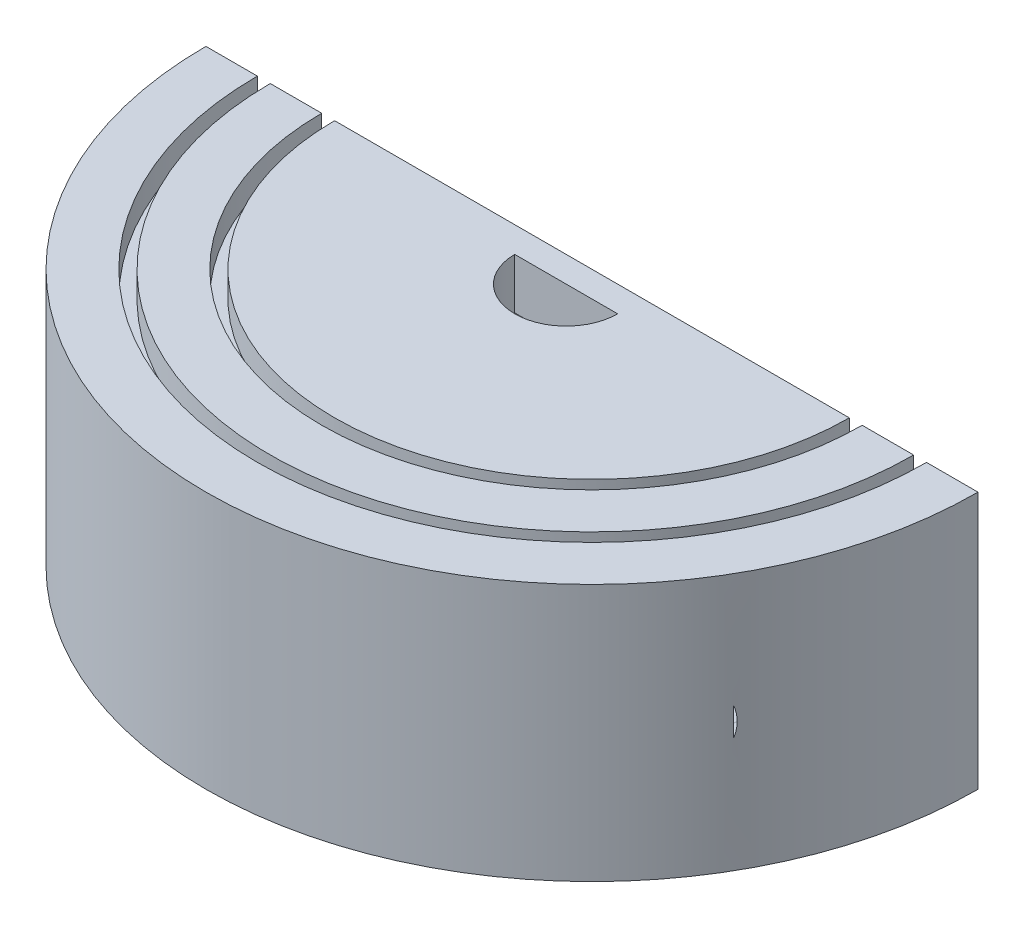
ISO-10303-21;
HEADER;
FILE_DESCRIPTION(('STEP AP214'),'2;1');
FILE_NAME('part.step','',(''),(''),'','','');
FILE_SCHEMA(('AUTOMOTIVE_DESIGN { 1 0 10303 214 1 1 1 1 }'));
ENDSEC;
DATA;
#1=APPLICATION_CONTEXT('core data for automotive mechanical design processes');
#2=APPLICATION_PROTOCOL_DEFINITION('international standard','automotive_design',2000,#1);
#3=PRODUCT_CONTEXT('',#1,'mechanical');
#4=PRODUCT('Part','Part','',(#3));
#5=PRODUCT_RELATED_PRODUCT_CATEGORY('part','',(#4));
#6=PRODUCT_DEFINITION_FORMATION('','',#4);
#7=PRODUCT_DEFINITION_CONTEXT('part definition',#1,'design');
#8=PRODUCT_DEFINITION('design','',#6,#7);
#9=PRODUCT_DEFINITION_SHAPE('','',#8);
#10=(LENGTH_UNIT() NAMED_UNIT(*) SI_UNIT(.MILLI.,.METRE.));
#11=(NAMED_UNIT(*) PLANE_ANGLE_UNIT() SI_UNIT($,.RADIAN.));
#12=(NAMED_UNIT(*) SI_UNIT($,.STERADIAN.) SOLID_ANGLE_UNIT());
#13=UNCERTAINTY_MEASURE_WITH_UNIT(LENGTH_MEASURE(1.E-05),#10,'distance_accuracy_value','');
#14=(GEOMETRIC_REPRESENTATION_CONTEXT(3) GLOBAL_UNCERTAINTY_ASSIGNED_CONTEXT((#13)) GLOBAL_UNIT_ASSIGNED_CONTEXT((#10,
#11,#12)) REPRESENTATION_CONTEXT('',''));
#15=CARTESIAN_POINT('',(0.,0.,0.));
#16=DIRECTION('',(0.,0.,1.));
#17=DIRECTION('',(1.,0.,0.));
#18=AXIS2_PLACEMENT_3D('',#15,#16,#17);
#19=CARTESIAN_POINT('',(15.,5.,0.));
#20=DIRECTION('',(0.,1.,0.));
#21=DIRECTION('',(0.,0.,1.));
#22=AXIS2_PLACEMENT_3D('',#19,#20,#21);
#23=PLANE('',#22);
#24=DIRECTION('',(-1.,0.,0.));
#25=VECTOR('',#24,1.);
#26=CARTESIAN_POINT('',(0.,5.,0.));
#27=LINE('',#26,#25);
#28=CARTESIAN_POINT('',(25.,5.,0.));
#29=VERTEX_POINT('',#28);
#30=CARTESIAN_POINT('',(5.,5.,0.));
#31=VERTEX_POINT('',#30);
#32=EDGE_CURVE('E578',#29,#31,#27,.T.);
#33=ORIENTED_EDGE('',*,*,#32,.T.);
#34=CARTESIAN_POINT('',(15.,5.,0.));
#35=DIRECTION('',(0.,1.,0.));
#36=DIRECTION('',(0.,0.,1.));
#37=AXIS2_PLACEMENT_3D('',#34,#35,#36);
#38=CIRCLE('',#37,10.);
#39=EDGE_CURVE('E310',#31,#29,#38,.T.);
#40=ORIENTED_EDGE('',*,*,#39,.T.);
#41=EDGE_LOOP('',(#33,#40));
#42=FACE_BOUND('',#41,.T.);
#43=DIRECTION('',(1.,0.,0.));
#44=VECTOR('',#43,1.);
#45=CARTESIAN_POINT('',(13.,5.,0.999999999999999));
#46=LINE('',#45,#44);
#47=CARTESIAN_POINT('',(13.,5.,0.999999999999999));
#48=VERTEX_POINT('',#47);
#49=CARTESIAN_POINT('',(17.,5.,0.999999999999999));
#50=VERTEX_POINT('',#49);
#51=EDGE_CURVE('E229',#48,#50,#46,.T.);
#52=ORIENTED_EDGE('',*,*,#51,.T.);
#53=CARTESIAN_POINT('',(15.,5.,0.999999999999996));
#54=DIRECTION('',(0.,-1.,0.));
#55=DIRECTION('',(0.,0.,1.));
#56=AXIS2_PLACEMENT_3D('',#53,#54,#55);
#57=CIRCLE('',#56,2.);
#58=EDGE_CURVE('E60',#50,#48,#57,.T.);
#59=ORIENTED_EDGE('',*,*,#58,.T.);
#60=EDGE_LOOP('',(#52,#59));
#61=FACE_BOUND('',#60,.T.);
#62=ADVANCED_FACE('F43',(#42,#61),#23,.T.);
#63=CARTESIAN_POINT('',(5.03017551316105,3.03195270623563,7.5));
#64=DIRECTION('',(0.,1.,0.));
#65=DIRECTION('',(-1.,0.,0.));
#66=AXIS2_PLACEMENT_3D('',#63,#64,#65);
#67=PLANE('',#66);
#68=DIRECTION('',(1.,0.,0.));
#69=VECTOR('',#68,1.);
#70=CARTESIAN_POINT('',(5.03017551316105,3.03195270623563,0.));
#71=LINE('',#70,#69);
#72=CARTESIAN_POINT('',(5.03017551316105,3.03195270623563,0.));
#73=VERTEX_POINT('',#72);
#74=CARTESIAN_POINT('',(25.0301755131611,3.03195270623562,0.));
#75=VERTEX_POINT('',#74);
#76=EDGE_CURVE('E288',#73,#75,#71,.T.);
#77=ORIENTED_EDGE('',*,*,#76,.T.);
#78=DIRECTION('',(0.,0.,-1.));
#79=VECTOR('',#78,1.);
#80=CARTESIAN_POINT('',(25.0301755131611,3.03195270623562,7.5));
#81=LINE('',#80,#79);
#82=CARTESIAN_POINT('',(25.0301755131611,3.03195270623562,7.5));
#83=VERTEX_POINT('',#82);
#84=EDGE_CURVE('E292',#83,#75,#81,.T.);
#85=ORIENTED_EDGE('',*,*,#84,.F.);
#86=DIRECTION('',(1.,0.,0.));
#87=VECTOR('',#86,1.);
#88=CARTESIAN_POINT('',(5.03017551316105,3.03195270623563,7.5));
#89=LINE('',#88,#87);
#90=CARTESIAN_POINT('',(5.03017551316105,3.03195270623563,7.5));
#91=VERTEX_POINT('',#90);
#92=EDGE_CURVE('E273',#91,#83,#89,.T.);
#93=ORIENTED_EDGE('',*,*,#92,.F.);
#94=DIRECTION('',(0.,0.,-1.));
#95=VECTOR('',#94,1.);
#96=CARTESIAN_POINT('',(5.03017551316105,3.03195270623563,7.5));
#97=LINE('',#96,#95);
#98=EDGE_CURVE('E296',#91,#73,#97,.T.);
#99=ORIENTED_EDGE('',*,*,#98,.T.);
#100=EDGE_LOOP('',(#77,#85,#93,#99));
#101=FACE_BOUND('',#100,.T.);
#102=CARTESIAN_POINT('',(15.,3.03195270623562,0.999999999999996));
#103=DIRECTION('',(0.,1.,0.));
#104=DIRECTION('',(-1.,0.,0.));
#105=AXIS2_PLACEMENT_3D('',#102,#103,#104);
#106=CIRCLE('',#105,2.);
#107=CARTESIAN_POINT('',(17.,3.03195270623562,0.999999999999999));
#108=VERTEX_POINT('',#107);
#109=CARTESIAN_POINT('',(13.,3.03195270623562,0.999999999999998));
#110=VERTEX_POINT('',#109);
#111=EDGE_CURVE('E11',#108,#110,#106,.F.);
#112=ORIENTED_EDGE('',*,*,#111,.F.);
#113=DIRECTION('',(1.,0.,0.));
#114=VECTOR('',#113,1.);
#115=CARTESIAN_POINT('',(5.03017551316105,3.03195270623563,0.999999999999998));
#116=LINE('',#115,#114);
#117=EDGE_CURVE('E53',#110,#108,#116,.T.);
#118=ORIENTED_EDGE('',*,*,#117,.F.);
#119=EDGE_LOOP('',(#112,#118));
#120=FACE_BOUND('',#119,.T.);
#121=ADVANCED_FACE('F561',(#101,#120),#67,.F.);
#122=CARTESIAN_POINT('',(0.,5.,0.));
#123=DIRECTION('',(0.,0.,1.));
#124=DIRECTION('',(1.,0.,0.));
#125=AXIS2_PLACEMENT_3D('',#122,#123,#124);
#126=PLANE('',#125);
#127=DIRECTION('',(-1.,0.,0.));
#128=VECTOR('',#127,1.);
#129=CARTESIAN_POINT('',(25.0301755131611,-3.,0.));
#130=LINE('',#129,#128);
#131=CARTESIAN_POINT('',(25.0301755131611,-3.,0.));
#132=VERTEX_POINT('',#131);
#133=CARTESIAN_POINT('',(5.03017551316105,-3.,0.));
#134=VERTEX_POINT('',#133);
#135=EDGE_CURVE('E280',#132,#134,#130,.T.);
#136=ORIENTED_EDGE('',*,*,#135,.F.);
#137=CARTESIAN_POINT('',(25.0301755131611,0.0159763531178115,0.));
#138=DIRECTION('',(0.,0.,-1.));
#139=DIRECTION('',(-1.,0.,0.));
#140=AXIS2_PLACEMENT_3D('',#137,#138,#139);
#141=CIRCLE('',#140,3.01597635311781);
#142=EDGE_CURVE('E257',#75,#132,#141,.T.);
#143=ORIENTED_EDGE('',*,*,#142,.F.);
#144=ORIENTED_EDGE('',*,*,#76,.F.);
#145=CARTESIAN_POINT('',(5.03017551316105,0.0159763531178128,0.));
#146=DIRECTION('',(0.,0.,-1.));
#147=DIRECTION('',(1.,0.,0.));
#148=AXIS2_PLACEMENT_3D('',#145,#146,#147);
#149=CIRCLE('',#148,3.01597635311781);
#150=EDGE_CURVE('E284',#134,#73,#149,.T.);
#151=ORIENTED_EDGE('',*,*,#150,.F.);
#152=EDGE_LOOP('',(#136,#143,#144,#151));
#153=FACE_BOUND('',#152,.T.);
#154=DIRECTION('',(0.,1.,0.));
#155=VECTOR('',#154,1.);
#156=CARTESIAN_POINT('',(4.5,4.,0.));
#157=LINE('',#156,#155);
#158=CARTESIAN_POINT('',(4.5,4.,0.));
#159=VERTEX_POINT('',#158);
#160=CARTESIAN_POINT('',(4.5,5.,0.));
#161=VERTEX_POINT('',#160);
#162=EDGE_CURVE('E328',#159,#161,#157,.T.);
#163=ORIENTED_EDGE('',*,*,#162,.F.);
#164=DIRECTION('',(1.,0.,0.));
#165=VECTOR('',#164,1.);
#166=CARTESIAN_POINT('',(4.5,4.,0.));
#167=LINE('',#166,#165);
#168=CARTESIAN_POINT('',(5.,4.,0.));
#169=VERTEX_POINT('',#168);
#170=EDGE_CURVE('E317',#159,#169,#167,.T.);
#171=ORIENTED_EDGE('',*,*,#170,.T.);
#172=DIRECTION('',(0.,1.,0.));
#173=VECTOR('',#172,1.);
#174=CARTESIAN_POINT('',(5.,4.,0.));
#175=LINE('',#174,#173);
#176=EDGE_CURVE('E332',#169,#31,#175,.T.);
#177=ORIENTED_EDGE('',*,*,#176,.T.);
#178=ORIENTED_EDGE('',*,*,#32,.F.);
#179=DIRECTION('',(0.,1.,0.));
#180=VECTOR('',#179,1.);
#181=CARTESIAN_POINT('',(25.,4.,0.));
#182=LINE('',#181,#180);
#183=CARTESIAN_POINT('',(25.,4.,0.));
#184=VERTEX_POINT('',#183);
#185=EDGE_CURVE('E336',#184,#29,#182,.T.);
#186=ORIENTED_EDGE('',*,*,#185,.F.);
#187=DIRECTION('',(1.,0.,0.));
#188=VECTOR('',#187,1.);
#189=CARTESIAN_POINT('',(25.,4.,0.));
#190=LINE('',#189,#188);
#191=CARTESIAN_POINT('',(25.5,4.,0.));
#192=VERTEX_POINT('',#191);
#193=EDGE_CURVE('E309',#184,#192,#190,.T.);
#194=ORIENTED_EDGE('',*,*,#193,.T.);
#195=DIRECTION('',(0.,1.,0.));
#196=VECTOR('',#195,1.);
#197=CARTESIAN_POINT('',(25.5,4.,0.));
#198=LINE('',#197,#196);
#199=CARTESIAN_POINT('',(25.5,5.,0.));
#200=VERTEX_POINT('',#199);
#201=EDGE_CURVE('E321',#192,#200,#198,.T.);
#202=ORIENTED_EDGE('',*,*,#201,.T.);
#203=CARTESIAN_POINT('',(27.5,5.,0.));
#204=VERTEX_POINT('',#203);
#205=EDGE_CURVE('E463',#204,#200,#27,.T.);
#206=ORIENTED_EDGE('',*,*,#205,.F.);
#207=DIRECTION('',(0.,1.,0.));
#208=VECTOR('',#207,1.);
#209=CARTESIAN_POINT('',(27.5,4.,0.));
#210=LINE('',#209,#208);
#211=CARTESIAN_POINT('',(27.5,4.,0.));
#212=VERTEX_POINT('',#211);
#213=EDGE_CURVE('E373',#212,#204,#210,.T.);
#214=ORIENTED_EDGE('',*,*,#213,.F.);
#215=DIRECTION('',(1.,0.,0.));
#216=VECTOR('',#215,1.);
#217=CARTESIAN_POINT('',(27.5,4.,0.));
#218=LINE('',#217,#216);
#219=CARTESIAN_POINT('',(28.,4.,0.));
#220=VERTEX_POINT('',#219);
#221=EDGE_CURVE('E346',#212,#220,#218,.T.);
#222=ORIENTED_EDGE('',*,*,#221,.T.);
#223=DIRECTION('',(0.,1.,0.));
#224=VECTOR('',#223,1.);
#225=CARTESIAN_POINT('',(28.,4.,0.));
#226=LINE('',#225,#224);
#227=CARTESIAN_POINT('',(28.,5.,0.));
#228=VERTEX_POINT('',#227);
#229=EDGE_CURVE('E358',#220,#228,#226,.T.);
#230=ORIENTED_EDGE('',*,*,#229,.T.);
#231=CARTESIAN_POINT('',(30.,5.,0.));
#232=VERTEX_POINT('',#231);
#233=EDGE_CURVE('E458',#232,#228,#27,.T.);
#234=ORIENTED_EDGE('',*,*,#233,.F.);
#235=DIRECTION('',(0.,-1.,0.));
#236=VECTOR('',#235,1.);
#237=CARTESIAN_POINT('',(30.,5.,0.));
#238=LINE('',#237,#236);
#239=CARTESIAN_POINT('',(30.,-5.,0.));
#240=VERTEX_POINT('',#239);
#241=EDGE_CURVE('E477',#232,#240,#238,.T.);
#242=ORIENTED_EDGE('',*,*,#241,.T.);
#243=DIRECTION('',(-1.,0.,0.));
#244=VECTOR('',#243,1.);
#245=CARTESIAN_POINT('',(0.,-5.,0.));
#246=LINE('',#245,#244);
#247=CARTESIAN_POINT('',(28.,-5.,0.));
#248=VERTEX_POINT('',#247);
#249=EDGE_CURVE('E457',#240,#248,#246,.T.);
#250=ORIENTED_EDGE('',*,*,#249,.T.);
#251=DIRECTION('',(0.,-1.,0.));
#252=VECTOR('',#251,1.);
#253=CARTESIAN_POINT('',(28.,-4.,0.));
#254=LINE('',#253,#252);
#255=CARTESIAN_POINT('',(28.,-4.,0.));
#256=VERTEX_POINT('',#255);
#257=EDGE_CURVE('E437',#256,#248,#254,.T.);
#258=ORIENTED_EDGE('',*,*,#257,.F.);
#259=DIRECTION('',(1.,0.,0.));
#260=VECTOR('',#259,1.);
#261=CARTESIAN_POINT('',(27.5,-4.,0.));
#262=LINE('',#261,#260);
#263=CARTESIAN_POINT('',(27.5,-4.,0.));
#264=VERTEX_POINT('',#263);
#265=EDGE_CURVE('E428',#264,#256,#262,.T.);
#266=ORIENTED_EDGE('',*,*,#265,.F.);
#267=DIRECTION('',(0.,-1.,0.));
#268=VECTOR('',#267,1.);
#269=CARTESIAN_POINT('',(27.5,-4.,0.));
#270=LINE('',#269,#268);
#271=CARTESIAN_POINT('',(27.5,-5.,0.));
#272=VERTEX_POINT('',#271);
#273=EDGE_CURVE('E441',#264,#272,#270,.T.);
#274=ORIENTED_EDGE('',*,*,#273,.T.);
#275=CARTESIAN_POINT('',(25.5,-5.,0.));
#276=VERTEX_POINT('',#275);
#277=EDGE_CURVE('E472',#272,#276,#246,.T.);
#278=ORIENTED_EDGE('',*,*,#277,.T.);
#279=DIRECTION('',(0.,-1.,0.));
#280=VECTOR('',#279,1.);
#281=CARTESIAN_POINT('',(25.5,-4.,0.));
#282=LINE('',#281,#280);
#283=CARTESIAN_POINT('',(25.5,-4.,0.));
#284=VERTEX_POINT('',#283);
#285=EDGE_CURVE('E401',#284,#276,#282,.T.);
#286=ORIENTED_EDGE('',*,*,#285,.F.);
#287=DIRECTION('',(1.,0.,0.));
#288=VECTOR('',#287,1.);
#289=CARTESIAN_POINT('',(25.,-4.,0.));
#290=LINE('',#289,#288);
#291=CARTESIAN_POINT('',(25.,-4.,0.));
#292=VERTEX_POINT('',#291);
#293=EDGE_CURVE('E392',#292,#284,#290,.T.);
#294=ORIENTED_EDGE('',*,*,#293,.F.);
#295=DIRECTION('',(0.,-1.,0.));
#296=VECTOR('',#295,1.);
#297=CARTESIAN_POINT('',(25.,-4.,0.));
#298=LINE('',#297,#296);
#299=CARTESIAN_POINT('',(25.,-5.,0.));
#300=VERTEX_POINT('',#299);
#301=EDGE_CURVE('E405',#292,#300,#298,.T.);
#302=ORIENTED_EDGE('',*,*,#301,.T.);
#303=CARTESIAN_POINT('',(5.,-5.,0.));
#304=VERTEX_POINT('',#303);
#305=EDGE_CURVE('E618',#300,#304,#246,.T.);
#306=ORIENTED_EDGE('',*,*,#305,.T.);
#307=DIRECTION('',(0.,-1.,0.));
#308=VECTOR('',#307,1.);
#309=CARTESIAN_POINT('',(5.,-4.,0.));
#310=LINE('',#309,#308);
#311=CARTESIAN_POINT('',(5.,-4.,0.));
#312=VERTEX_POINT('',#311);
#313=EDGE_CURVE('E409',#312,#304,#310,.T.);
#314=ORIENTED_EDGE('',*,*,#313,.F.);
#315=DIRECTION('',(1.,0.,0.));
#316=VECTOR('',#315,1.);
#317=CARTESIAN_POINT('',(4.5,-4.,0.));
#318=LINE('',#317,#316);
#319=CARTESIAN_POINT('',(4.5,-4.,0.));
#320=VERTEX_POINT('',#319);
#321=EDGE_CURVE('E383',#320,#312,#318,.T.);
#322=ORIENTED_EDGE('',*,*,#321,.F.);
#323=DIRECTION('',(0.,-1.,0.));
#324=VECTOR('',#323,1.);
#325=CARTESIAN_POINT('',(4.5,-4.,0.));
#326=LINE('',#325,#324);
#327=CARTESIAN_POINT('',(4.5,-5.,0.));
#328=VERTEX_POINT('',#327);
#329=EDGE_CURVE('E396',#320,#328,#326,.T.);
#330=ORIENTED_EDGE('',*,*,#329,.T.);
#331=CARTESIAN_POINT('',(2.5,-5.,0.));
#332=VERTEX_POINT('',#331);
#333=EDGE_CURVE('E473',#328,#332,#246,.T.);
#334=ORIENTED_EDGE('',*,*,#333,.T.);
#335=DIRECTION('',(0.,-1.,0.));
#336=VECTOR('',#335,1.);
#337=CARTESIAN_POINT('',(2.5,-4.,0.));
#338=LINE('',#337,#336);
#339=CARTESIAN_POINT('',(2.5,-4.,0.));
#340=VERTEX_POINT('',#339);
#341=EDGE_CURVE('E445',#340,#332,#338,.T.);
#342=ORIENTED_EDGE('',*,*,#341,.F.);
#343=DIRECTION('',(1.,0.,0.));
#344=VECTOR('',#343,1.);
#345=CARTESIAN_POINT('',(2.,-4.,0.));
#346=LINE('',#345,#344);
#347=CARTESIAN_POINT('',(2.,-4.,0.));
#348=VERTEX_POINT('',#347);
#349=EDGE_CURVE('E419',#348,#340,#346,.T.);
#350=ORIENTED_EDGE('',*,*,#349,.F.);
#351=DIRECTION('',(0.,-1.,0.));
#352=VECTOR('',#351,1.);
#353=CARTESIAN_POINT('',(2.,-4.,0.));
#354=LINE('',#353,#352);
#355=CARTESIAN_POINT('',(2.,-5.,0.));
#356=VERTEX_POINT('',#355);
#357=EDGE_CURVE('E432',#348,#356,#354,.T.);
#358=ORIENTED_EDGE('',*,*,#357,.T.);
#359=CARTESIAN_POINT('',(0.,-5.,0.));
#360=VERTEX_POINT('',#359);
#361=EDGE_CURVE('E468',#356,#360,#246,.T.);
#362=ORIENTED_EDGE('',*,*,#361,.T.);
#363=DIRECTION('',(0.,-1.,0.));
#364=VECTOR('',#363,1.);
#365=CARTESIAN_POINT('',(0.,5.,0.));
#366=LINE('',#365,#364);
#367=CARTESIAN_POINT('',(0.,5.,0.));
#368=VERTEX_POINT('',#367);
#369=EDGE_CURVE('E462',#368,#360,#366,.T.);
#370=ORIENTED_EDGE('',*,*,#369,.F.);
#371=CARTESIAN_POINT('',(2.,5.,0.));
#372=VERTEX_POINT('',#371);
#373=EDGE_CURVE('E456',#372,#368,#27,.T.);
#374=ORIENTED_EDGE('',*,*,#373,.F.);
#375=DIRECTION('',(0.,1.,0.));
#376=VECTOR('',#375,1.);
#377=CARTESIAN_POINT('',(2.,4.,0.));
#378=LINE('',#377,#376);
#379=CARTESIAN_POINT('',(2.,4.,0.));
#380=VERTEX_POINT('',#379);
#381=EDGE_CURVE('E365',#380,#372,#378,.T.);
#382=ORIENTED_EDGE('',*,*,#381,.F.);
#383=DIRECTION('',(1.,0.,0.));
#384=VECTOR('',#383,1.);
#385=CARTESIAN_POINT('',(2.,4.,0.));
#386=LINE('',#385,#384);
#387=CARTESIAN_POINT('',(2.5,4.,0.));
#388=VERTEX_POINT('',#387);
#389=EDGE_CURVE('E354',#380,#388,#386,.T.);
#390=ORIENTED_EDGE('',*,*,#389,.T.);
#391=DIRECTION('',(0.,1.,0.));
#392=VECTOR('',#391,1.);
#393=CARTESIAN_POINT('',(2.5,4.,0.));
#394=LINE('',#393,#392);
#395=CARTESIAN_POINT('',(2.5,5.,0.));
#396=VERTEX_POINT('',#395);
#397=EDGE_CURVE('E369',#388,#396,#394,.T.);
#398=ORIENTED_EDGE('',*,*,#397,.T.);
#399=EDGE_CURVE('E464',#161,#396,#27,.T.);
#400=ORIENTED_EDGE('',*,*,#399,.F.);
#401=EDGE_LOOP('',(#163,#171,#177,#178,#186,#194,#202,#206,#214,#222,#230,#234,#242,#250,#258,
#266,#274,#278,#286,#294,#302,#306,#314,#322,#330,#334,#342,#350,#358,#362,#370,#374,#382,#390,
#398,#400));
#402=FACE_BOUND('',#401,.T.);
#403=ADVANCED_FACE('F559',(#153,#402),#126,.F.);
#404=ORIENTED_EDGE('',*,*,#205,.T.);
#405=CARTESIAN_POINT('',(15.,5.,0.));
#406=DIRECTION('',(0.,-1.,0.));
#407=DIRECTION('',(0.,0.,1.));
#408=AXIS2_PLACEMENT_3D('',#405,#406,#407);
#409=CIRCLE('',#408,10.5);
#410=EDGE_CURVE('E295',#200,#161,#409,.T.);
#411=ORIENTED_EDGE('',*,*,#410,.T.);
#412=ORIENTED_EDGE('',*,*,#399,.T.);
#413=CARTESIAN_POINT('',(15.,5.,0.));
#414=DIRECTION('',(0.,1.,0.));
#415=DIRECTION('',(0.,0.,1.));
#416=AXIS2_PLACEMENT_3D('',#413,#414,#415);
#417=CIRCLE('',#416,12.5);
#418=EDGE_CURVE('E347',#396,#204,#417,.T.);
#419=ORIENTED_EDGE('',*,*,#418,.T.);
#420=EDGE_LOOP('',(#404,#411,#412,#419));
#421=FACE_BOUND('',#420,.T.);
#422=ADVANCED_FACE('F554',(#421),#23,.T.);
#423=ORIENTED_EDGE('',*,*,#233,.T.);
#424=CARTESIAN_POINT('',(15.,5.,0.));
#425=DIRECTION('',(0.,-1.,0.));
#426=DIRECTION('',(0.,0.,1.));
#427=AXIS2_PLACEMENT_3D('',#424,#425,#426);
#428=CIRCLE('',#427,13.);
#429=EDGE_CURVE('E331',#228,#372,#428,.T.);
#430=ORIENTED_EDGE('',*,*,#429,.T.);
#431=ORIENTED_EDGE('',*,*,#373,.T.);
#432=CARTESIAN_POINT('',(15.,5.,0.));
#433=DIRECTION('',(0.,1.,0.));
#434=DIRECTION('',(0.,0.,1.));
#435=AXIS2_PLACEMENT_3D('',#432,#433,#434);
#436=CIRCLE('',#435,15.);
#437=EDGE_CURVE('E452',#368,#232,#436,.T.);
#438=ORIENTED_EDGE('',*,*,#437,.T.);
#439=EDGE_LOOP('',(#423,#430,#431,#438));
#440=FACE_BOUND('',#439,.T.);
#441=ADVANCED_FACE('F550',(#440),#23,.T.);
#442=CARTESIAN_POINT('',(15.,-5.,0.));
#443=DIRECTION('',(0.,1.,0.));
#444=DIRECTION('',(0.,0.,1.));
#445=AXIS2_PLACEMENT_3D('',#442,#443,#444);
#446=PLANE('',#445);
#447=ORIENTED_EDGE('',*,*,#333,.F.);
#448=CARTESIAN_POINT('',(15.,-5.,0.));
#449=DIRECTION('',(0.,-1.,0.));
#450=DIRECTION('',(0.,0.,1.));
#451=AXIS2_PLACEMENT_3D('',#448,#449,#450);
#452=CIRCLE('',#451,10.5);
#453=EDGE_CURVE('E368',#276,#328,#452,.T.);
#454=ORIENTED_EDGE('',*,*,#453,.F.);
#455=ORIENTED_EDGE('',*,*,#277,.F.);
#456=CARTESIAN_POINT('',(15.,-5.,0.));
#457=DIRECTION('',(0.,1.,0.));
#458=DIRECTION('',(0.,0.,1.));
#459=AXIS2_PLACEMENT_3D('',#456,#457,#458);
#460=CIRCLE('',#459,12.5);
#461=EDGE_CURVE('E420',#332,#272,#460,.T.);
#462=ORIENTED_EDGE('',*,*,#461,.F.);
#463=EDGE_LOOP('',(#447,#454,#455,#462));
#464=FACE_BOUND('',#463,.T.);
#465=ADVANCED_FACE('F553',(#464),#446,.F.);
#466=ORIENTED_EDGE('',*,*,#361,.F.);
#467=CARTESIAN_POINT('',(15.,-5.,0.));
#468=DIRECTION('',(0.,-1.,0.));
#469=DIRECTION('',(0.,0.,1.));
#470=AXIS2_PLACEMENT_3D('',#467,#468,#469);
#471=CIRCLE('',#470,13.);
#472=EDGE_CURVE('E404',#248,#356,#471,.T.);
#473=ORIENTED_EDGE('',*,*,#472,.F.);
#474=ORIENTED_EDGE('',*,*,#249,.F.);
#475=CARTESIAN_POINT('',(15.,-5.,0.));
#476=DIRECTION('',(0.,1.,0.));
#477=DIRECTION('',(0.,0.,1.));
#478=AXIS2_PLACEMENT_3D('',#475,#476,#477);
#479=CIRCLE('',#478,15.);
#480=EDGE_CURVE('E440',#360,#240,#479,.T.);
#481=ORIENTED_EDGE('',*,*,#480,.F.);
#482=EDGE_LOOP('',(#466,#473,#474,#481));
#483=FACE_BOUND('',#482,.T.);
#484=ADVANCED_FACE('F558',(#483),#446,.F.);
#485=CARTESIAN_POINT('',(15.,5.,0.));
#486=DIRECTION('',(0.,-1.,0.));
#487=DIRECTION('',(0.,0.,-1.));
#488=AXIS2_PLACEMENT_3D('',#485,#486,#487);
#489=CYLINDRICAL_SURFACE('',#488,15.);
#490=DIRECTION('',(0.,-1.,0.));
#491=VECTOR('',#490,1.);
#492=CARTESIAN_POINT('',(27.9903810567666,5.,7.5));
#493=LINE('',#492,#491);
#494=CARTESIAN_POINT('',(27.9903810567666,0.593294724705732,7.5));
#495=VERTEX_POINT('',#494);
#496=CARTESIAN_POINT('',(27.9903810567666,-0.561342018470109,7.5));
#497=VERTEX_POINT('',#496);
#498=EDGE_CURVE('E481',#495,#497,#493,.T.);
#499=ORIENTED_EDGE('',*,*,#498,.F.);
#500=CARTESIAN_POINT('',(27.9903810567666,0.593294724705732,7.5));
#501=CARTESIAN_POINT('',(27.9984900648463,0.551717165458329,7.48595424944893));
#502=CARTESIAN_POINT('',(28.0058041978693,0.50954217929078,7.47323395373268));
#503=CARTESIAN_POINT('',(28.0187199121707,0.424127161387559,7.45071139909798));
#504=CARTESIAN_POINT('',(28.0243200191941,0.380886247177474,7.44091165236944));
#505=CARTESIAN_POINT('',(28.0383188183036,0.250120361643426,7.41637498908912));
#506=CARTESIAN_POINT('',(28.0439642568141,0.161310318781378,7.40641641348626));
#507=CARTESIAN_POINT('',(28.0472984422139,-0.0172946598070621,7.40054177530781));
#508=CARTESIAN_POINT('',(28.0449506683543,-0.107092242584141,7.40469016694302));
#509=CARTESIAN_POINT('',(28.0324782762873,-0.284306904786718,7.42661792395137));
#510=CARTESIAN_POINT('',(28.0223664348963,-0.371727651132993,7.44437489448926));
#511=CARTESIAN_POINT('',(28.0060625687695,-0.474464231465477,7.47277499504538));
#512=CARTESIAN_POINT('',(28.0031197783482,-0.49199125018281,7.47789498397903));
#513=CARTESIAN_POINT('',(27.9969567146168,-0.526824733467985,7.4886016797013));
#514=CARTESIAN_POINT('',(27.9937368452057,-0.544131478231265,7.49418770679379));
#515=CARTESIAN_POINT('',(27.9903810567666,-0.561342018470109,7.50000000000001));
#516=B_SPLINE_CURVE_WITH_KNOTS('',3,(#500,#501,#502,#503,#504,#505,#506,#507,#508,#509,#510,
#511,#512,#513,#514,#515),.UNSPECIFIED.,.F.,.F.,(4,2,2,2,2,2,2,4),(0.,0.133835281276028,
0.26778535453262,0.534912971763941,0.803262721932365,1.07117181050821,1.12665491525787,
1.18205846942805),.UNSPECIFIED.);
#517=EDGE_CURVE('E484',#495,#497,#516,.T.);
#518=ORIENTED_EDGE('',*,*,#517,.T.);
#519=EDGE_LOOP('',(#499,#518));
#520=FACE_BOUND('',#519,.T.);
#521=ORIENTED_EDGE('',*,*,#480,.T.);
#522=ORIENTED_EDGE('',*,*,#241,.F.);
#523=ORIENTED_EDGE('',*,*,#437,.F.);
#524=ORIENTED_EDGE('',*,*,#369,.T.);
#525=EDGE_LOOP('',(#521,#522,#523,#524));
#526=FACE_BOUND('',#525,.T.);
#527=ADVANCED_FACE('F45',(#520,#526),#489,.T.);
#528=DIRECTION('',(1.,0.,0.));
#529=VECTOR('',#528,1.);
#530=CARTESIAN_POINT('',(13.,-5.,0.999999999999999));
#531=LINE('',#530,#529);
#532=CARTESIAN_POINT('',(13.,-5.,0.999999999999999));
#533=VERTEX_POINT('',#532);
#534=CARTESIAN_POINT('',(17.,-5.,0.999999999999999));
#535=VERTEX_POINT('',#534);
#536=EDGE_CURVE('E244',#533,#535,#531,.T.);
#537=ORIENTED_EDGE('',*,*,#536,.F.);
#538=CARTESIAN_POINT('',(15.,-5.,0.999999999999996));
#539=DIRECTION('',(0.,-1.,0.));
#540=DIRECTION('',(0.,0.,1.));
#541=AXIS2_PLACEMENT_3D('',#538,#539,#540);
#542=CIRCLE('',#541,2.);
#543=EDGE_CURVE('E225',#535,#533,#542,.T.);
#544=ORIENTED_EDGE('',*,*,#543,.F.);
#545=EDGE_LOOP('',(#537,#544));
#546=FACE_BOUND('',#545,.T.);
#547=ORIENTED_EDGE('',*,*,#305,.F.);
#548=CARTESIAN_POINT('',(15.,-5.,0.));
#549=DIRECTION('',(0.,1.,0.));
#550=DIRECTION('',(0.,0.,1.));
#551=AXIS2_PLACEMENT_3D('',#548,#549,#550);
#552=CIRCLE('',#551,10.);
#553=EDGE_CURVE('E384',#304,#300,#552,.T.);
#554=ORIENTED_EDGE('',*,*,#553,.F.);
#555=EDGE_LOOP('',(#547,#554));
#556=FACE_BOUND('',#555,.T.);
#557=ADVANCED_FACE('F548',(#546,#556),#446,.F.);
#558=CARTESIAN_POINT('',(15.,-4.,0.));
#559=DIRECTION('',(0.,-1.,0.));
#560=DIRECTION('',(0.,0.,-1.));
#561=AXIS2_PLACEMENT_3D('',#558,#559,#560);
#562=CYLINDRICAL_SURFACE('',#561,13.);
#563=ORIENTED_EDGE('',*,*,#472,.T.);
#564=ORIENTED_EDGE('',*,*,#357,.F.);
#565=CARTESIAN_POINT('',(15.,-4.,0.));
#566=DIRECTION('',(0.,-1.,0.));
#567=DIRECTION('',(0.,0.,1.));
#568=AXIS2_PLACEMENT_3D('',#565,#566,#567);
#569=CIRCLE('',#568,13.);
#570=EDGE_CURVE('E415',#256,#348,#569,.T.);
#571=ORIENTED_EDGE('',*,*,#570,.F.);
#572=ORIENTED_EDGE('',*,*,#257,.T.);
#573=EDGE_LOOP('',(#563,#564,#571,#572));
#574=FACE_BOUND('',#573,.T.);
#575=ADVANCED_FACE('F544',(#574),#562,.F.);
#576=CARTESIAN_POINT('',(15.,-4.,0.));
#577=DIRECTION('',(0.,-1.,0.));
#578=DIRECTION('',(0.,0.,-1.));
#579=AXIS2_PLACEMENT_3D('',#576,#577,#578);
#580=CYLINDRICAL_SURFACE('',#579,12.5);
#581=ORIENTED_EDGE('',*,*,#461,.T.);
#582=ORIENTED_EDGE('',*,*,#273,.F.);
#583=CARTESIAN_POINT('',(15.,-4.,0.));
#584=DIRECTION('',(0.,1.,0.));
#585=DIRECTION('',(0.,0.,1.));
#586=AXIS2_PLACEMENT_3D('',#583,#584,#585);
#587=CIRCLE('',#586,12.5);
#588=EDGE_CURVE('E424',#340,#264,#587,.T.);
#589=ORIENTED_EDGE('',*,*,#588,.F.);
#590=ORIENTED_EDGE('',*,*,#341,.T.);
#591=EDGE_LOOP('',(#581,#582,#589,#590));
#592=FACE_BOUND('',#591,.T.);
#593=ADVANCED_FACE('F540',(#592),#580,.T.);
#594=CARTESIAN_POINT('',(15.,-4.,0.));
#595=DIRECTION('',(0.,1.,0.));
#596=DIRECTION('',(0.,0.,1.));
#597=AXIS2_PLACEMENT_3D('',#594,#595,#596);
#598=PLANE('',#597);
#599=ORIENTED_EDGE('',*,*,#570,.T.);
#600=ORIENTED_EDGE('',*,*,#349,.T.);
#601=ORIENTED_EDGE('',*,*,#588,.T.);
#602=ORIENTED_EDGE('',*,*,#265,.T.);
#603=EDGE_LOOP('',(#599,#600,#601,#602));
#604=FACE_BOUND('',#603,.T.);
#605=ADVANCED_FACE('F536',(#604),#598,.F.);
#606=CARTESIAN_POINT('',(15.,-4.,0.));
#607=DIRECTION('',(0.,-1.,0.));
#608=DIRECTION('',(0.,0.,-1.));
#609=AXIS2_PLACEMENT_3D('',#606,#607,#608);
#610=CYLINDRICAL_SURFACE('',#609,10.5);
#611=ORIENTED_EDGE('',*,*,#453,.T.);
#612=ORIENTED_EDGE('',*,*,#329,.F.);
#613=CARTESIAN_POINT('',(15.,-4.,0.));
#614=DIRECTION('',(0.,-1.,0.));
#615=DIRECTION('',(0.,0.,1.));
#616=AXIS2_PLACEMENT_3D('',#613,#614,#615);
#617=CIRCLE('',#616,10.5);
#618=EDGE_CURVE('E379',#284,#320,#617,.T.);
#619=ORIENTED_EDGE('',*,*,#618,.F.);
#620=ORIENTED_EDGE('',*,*,#285,.T.);
#621=EDGE_LOOP('',(#611,#612,#619,#620));
#622=FACE_BOUND('',#621,.T.);
#623=ADVANCED_FACE('F532',(#622),#610,.F.);
#624=CARTESIAN_POINT('',(15.,-4.,0.));
#625=DIRECTION('',(0.,-1.,0.));
#626=DIRECTION('',(0.,0.,-1.));
#627=AXIS2_PLACEMENT_3D('',#624,#625,#626);
#628=CYLINDRICAL_SURFACE('',#627,10.);
#629=ORIENTED_EDGE('',*,*,#553,.T.);
#630=ORIENTED_EDGE('',*,*,#301,.F.);
#631=CARTESIAN_POINT('',(15.,-4.,0.));
#632=DIRECTION('',(0.,1.,0.));
#633=DIRECTION('',(0.,0.,1.));
#634=AXIS2_PLACEMENT_3D('',#631,#632,#633);
#635=CIRCLE('',#634,10.);
#636=EDGE_CURVE('E388',#312,#292,#635,.T.);
#637=ORIENTED_EDGE('',*,*,#636,.F.);
#638=ORIENTED_EDGE('',*,*,#313,.T.);
#639=EDGE_LOOP('',(#629,#630,#637,#638));
#640=FACE_BOUND('',#639,.T.);
#641=ADVANCED_FACE('F528',(#640),#628,.T.);
#642=CARTESIAN_POINT('',(15.,-4.,0.));
#643=DIRECTION('',(0.,1.,0.));
#644=DIRECTION('',(0.,0.,1.));
#645=AXIS2_PLACEMENT_3D('',#642,#643,#644);
#646=PLANE('',#645);
#647=ORIENTED_EDGE('',*,*,#618,.T.);
#648=ORIENTED_EDGE('',*,*,#321,.T.);
#649=ORIENTED_EDGE('',*,*,#636,.T.);
#650=ORIENTED_EDGE('',*,*,#293,.T.);
#651=EDGE_LOOP('',(#647,#648,#649,#650));
#652=FACE_BOUND('',#651,.T.);
#653=ADVANCED_FACE('F524',(#652),#646,.F.);
#654=CARTESIAN_POINT('',(15.,4.,0.));
#655=DIRECTION('',(0.,1.,0.));
#656=DIRECTION('',(0.,0.,1.));
#657=AXIS2_PLACEMENT_3D('',#654,#655,#656);
#658=CYLINDRICAL_SURFACE('',#657,13.);
#659=ORIENTED_EDGE('',*,*,#429,.F.);
#660=ORIENTED_EDGE('',*,*,#229,.F.);
#661=CARTESIAN_POINT('',(15.,4.,0.));
#662=DIRECTION('',(0.,-1.,0.));
#663=DIRECTION('',(0.,0.,1.));
#664=AXIS2_PLACEMENT_3D('',#661,#662,#663);
#665=CIRCLE('',#664,13.);
#666=EDGE_CURVE('E342',#220,#380,#665,.T.);
#667=ORIENTED_EDGE('',*,*,#666,.T.);
#668=ORIENTED_EDGE('',*,*,#381,.T.);
#669=EDGE_LOOP('',(#659,#660,#667,#668));
#670=FACE_BOUND('',#669,.T.);
#671=ADVANCED_FACE('F520',(#670),#658,.F.);
#672=CARTESIAN_POINT('',(15.,4.,0.));
#673=DIRECTION('',(0.,1.,0.));
#674=DIRECTION('',(0.,0.,1.));
#675=AXIS2_PLACEMENT_3D('',#672,#673,#674);
#676=CYLINDRICAL_SURFACE('',#675,12.5);
#677=ORIENTED_EDGE('',*,*,#418,.F.);
#678=ORIENTED_EDGE('',*,*,#397,.F.);
#679=CARTESIAN_POINT('',(15.,4.,0.));
#680=DIRECTION('',(0.,1.,0.));
#681=DIRECTION('',(0.,0.,1.));
#682=AXIS2_PLACEMENT_3D('',#679,#680,#681);
#683=CIRCLE('',#682,12.5);
#684=EDGE_CURVE('E351',#388,#212,#683,.T.);
#685=ORIENTED_EDGE('',*,*,#684,.T.);
#686=ORIENTED_EDGE('',*,*,#213,.T.);
#687=EDGE_LOOP('',(#677,#678,#685,#686));
#688=FACE_BOUND('',#687,.T.);
#689=ADVANCED_FACE('F516',(#688),#676,.T.);
#690=CARTESIAN_POINT('',(15.,4.,0.));
#691=DIRECTION('',(0.,-1.,0.));
#692=DIRECTION('',(0.,0.,1.));
#693=AXIS2_PLACEMENT_3D('',#690,#691,#692);
#694=PLANE('',#693);
#695=ORIENTED_EDGE('',*,*,#666,.F.);
#696=ORIENTED_EDGE('',*,*,#221,.F.);
#697=ORIENTED_EDGE('',*,*,#684,.F.);
#698=ORIENTED_EDGE('',*,*,#389,.F.);
#699=EDGE_LOOP('',(#695,#696,#697,#698));
#700=FACE_BOUND('',#699,.T.);
#701=ADVANCED_FACE('F512',(#700),#694,.F.);
#702=CARTESIAN_POINT('',(15.,4.,0.));
#703=DIRECTION('',(0.,1.,0.));
#704=DIRECTION('',(0.,0.,1.));
#705=AXIS2_PLACEMENT_3D('',#702,#703,#704);
#706=CYLINDRICAL_SURFACE('',#705,10.5);
#707=ORIENTED_EDGE('',*,*,#410,.F.);
#708=ORIENTED_EDGE('',*,*,#201,.F.);
#709=CARTESIAN_POINT('',(15.,4.,0.));
#710=DIRECTION('',(0.,-1.,0.));
#711=DIRECTION('',(0.,0.,1.));
#712=AXIS2_PLACEMENT_3D('',#709,#710,#711);
#713=CIRCLE('',#712,10.5);
#714=EDGE_CURVE('E305',#192,#159,#713,.T.);
#715=ORIENTED_EDGE('',*,*,#714,.T.);
#716=ORIENTED_EDGE('',*,*,#162,.T.);
#717=EDGE_LOOP('',(#707,#708,#715,#716));
#718=FACE_BOUND('',#717,.T.);
#719=ADVANCED_FACE('F508',(#718),#706,.F.);
#720=CARTESIAN_POINT('',(15.,4.,0.));
#721=DIRECTION('',(0.,1.,0.));
#722=DIRECTION('',(0.,0.,1.));
#723=AXIS2_PLACEMENT_3D('',#720,#721,#722);
#724=CYLINDRICAL_SURFACE('',#723,10.);
#725=ORIENTED_EDGE('',*,*,#39,.F.);
#726=ORIENTED_EDGE('',*,*,#176,.F.);
#727=CARTESIAN_POINT('',(15.,4.,0.));
#728=DIRECTION('',(0.,1.,0.));
#729=DIRECTION('',(0.,0.,1.));
#730=AXIS2_PLACEMENT_3D('',#727,#728,#729);
#731=CIRCLE('',#730,10.);
#732=EDGE_CURVE('E314',#169,#184,#731,.T.);
#733=ORIENTED_EDGE('',*,*,#732,.T.);
#734=ORIENTED_EDGE('',*,*,#185,.T.);
#735=EDGE_LOOP('',(#725,#726,#733,#734));
#736=FACE_BOUND('',#735,.T.);
#737=ADVANCED_FACE('F504',(#736),#724,.T.);
#738=CARTESIAN_POINT('',(15.,4.,0.));
#739=DIRECTION('',(0.,-1.,0.));
#740=DIRECTION('',(0.,0.,1.));
#741=AXIS2_PLACEMENT_3D('',#738,#739,#740);
#742=PLANE('',#741);
#743=ORIENTED_EDGE('',*,*,#714,.F.);
#744=ORIENTED_EDGE('',*,*,#193,.F.);
#745=ORIENTED_EDGE('',*,*,#732,.F.);
#746=ORIENTED_EDGE('',*,*,#170,.F.);
#747=EDGE_LOOP('',(#743,#744,#745,#746));
#748=FACE_BOUND('',#747,.T.);
#749=ADVANCED_FACE('F498',(#748),#742,.F.);
#750=CARTESIAN_POINT('',(25.0301755131611,0.0159763531178115,7.5));
#751=DIRECTION('',(0.,0.,-1.));
#752=DIRECTION('',(-1.,0.,0.));
#753=AXIS2_PLACEMENT_3D('',#750,#751,#752);
#754=CYLINDRICAL_SURFACE('',#753,3.01597635311781);
#755=CARTESIAN_POINT('',(25.0301755131611,0.0159763531178115,7.5));
#756=DIRECTION('',(0.,0.,-1.));
#757=DIRECTION('',(-1.,0.,0.));
#758=AXIS2_PLACEMENT_3D('',#755,#756,#757);
#759=CIRCLE('',#758,3.01597635311781);
#760=EDGE_CURVE('E261',#83,#495,#759,.T.);
#761=ORIENTED_EDGE('',*,*,#760,.F.);
#762=ORIENTED_EDGE('',*,*,#84,.T.);
#763=ORIENTED_EDGE('',*,*,#142,.T.);
#764=DIRECTION('',(0.,0.,-1.));
#765=VECTOR('',#764,1.);
#766=CARTESIAN_POINT('',(25.0301755131611,-3.,7.5));
#767=LINE('',#766,#765);
#768=CARTESIAN_POINT('',(25.0301755131611,-3.,7.5));
#769=VERTEX_POINT('',#768);
#770=EDGE_CURVE('E277',#769,#132,#767,.T.);
#771=ORIENTED_EDGE('',*,*,#770,.F.);
#772=EDGE_CURVE('E265',#497,#769,#759,.T.);
#773=ORIENTED_EDGE('',*,*,#772,.F.);
#774=ORIENTED_EDGE('',*,*,#517,.F.);
#775=EDGE_LOOP('',(#761,#762,#763,#771,#773,#774));
#776=FACE_BOUND('',#775,.T.);
#777=ADVANCED_FACE('F492',(#776),#754,.F.);
#778=CARTESIAN_POINT('',(25.0301755131611,0.0159763531178115,7.5));
#779=DIRECTION('',(0.,0.,-1.));
#780=DIRECTION('',(-1.,0.,0.));
#781=AXIS2_PLACEMENT_3D('',#778,#779,#780);
#782=PLANE('',#781);
#783=ORIENTED_EDGE('',*,*,#498,.T.);
#784=ORIENTED_EDGE('',*,*,#772,.T.);
#785=DIRECTION('',(-1.,0.,0.));
#786=VECTOR('',#785,1.);
#787=CARTESIAN_POINT('',(25.0301755131611,-3.,7.5));
#788=LINE('',#787,#786);
#789=CARTESIAN_POINT('',(5.03017551316105,-3.,7.5));
#790=VERTEX_POINT('',#789);
#791=EDGE_CURVE('E264',#769,#790,#788,.T.);
#792=ORIENTED_EDGE('',*,*,#791,.T.);
#793=CARTESIAN_POINT('',(5.03017551316105,0.0159763531178128,7.5));
#794=DIRECTION('',(0.,0.,-1.));
#795=DIRECTION('',(1.,0.,0.));
#796=AXIS2_PLACEMENT_3D('',#793,#794,#795);
#797=CIRCLE('',#796,3.01597635311781);
#798=EDGE_CURVE('E269',#790,#91,#797,.T.);
#799=ORIENTED_EDGE('',*,*,#798,.T.);
#800=ORIENTED_EDGE('',*,*,#92,.T.);
#801=ORIENTED_EDGE('',*,*,#760,.T.);
#802=EDGE_LOOP('',(#783,#784,#792,#799,#800,#801));
#803=FACE_BOUND('',#802,.T.);
#804=ADVANCED_FACE('F497',(#803),#782,.T.);
#805=CARTESIAN_POINT('',(5.03017551316105,0.0159763531178128,7.5));
#806=DIRECTION('',(0.,0.,-1.));
#807=DIRECTION('',(-1.,0.,0.));
#808=AXIS2_PLACEMENT_3D('',#805,#806,#807);
#809=CYLINDRICAL_SURFACE('',#808,3.01597635311781);
#810=ORIENTED_EDGE('',*,*,#150,.T.);
#811=ORIENTED_EDGE('',*,*,#98,.F.);
#812=ORIENTED_EDGE('',*,*,#798,.F.);
#813=DIRECTION('',(0.,0.,-1.));
#814=VECTOR('',#813,1.);
#815=CARTESIAN_POINT('',(5.03017551316105,-3.,7.5));
#816=LINE('',#815,#814);
#817=EDGE_CURVE('E299',#790,#134,#816,.T.);
#818=ORIENTED_EDGE('',*,*,#817,.T.);
#819=EDGE_LOOP('',(#810,#811,#812,#818));
#820=FACE_BOUND('',#819,.T.);
#821=ADVANCED_FACE('F642',(#820),#809,.F.);
#822=CARTESIAN_POINT('',(25.0301755131611,-3.,7.5));
#823=DIRECTION('',(0.,-1.,0.));
#824=DIRECTION('',(0.,0.,-1.));
#825=AXIS2_PLACEMENT_3D('',#822,#823,#824);
#826=PLANE('',#825);
#827=DIRECTION('',(1.,0.,0.));
#828=VECTOR('',#827,1.);
#829=CARTESIAN_POINT('',(13.,-3.,0.999999999999999));
#830=LINE('',#829,#828);
#831=CARTESIAN_POINT('',(13.,-3.,0.999999999999999));
#832=VERTEX_POINT('',#831);
#833=CARTESIAN_POINT('',(17.,-3.,0.999999999999998));
#834=VERTEX_POINT('',#833);
#835=EDGE_CURVE('E243',#832,#834,#830,.T.);
#836=ORIENTED_EDGE('',*,*,#835,.T.);
#837=CARTESIAN_POINT('',(15.,-3.,0.999999999999996));
#838=DIRECTION('',(0.,-1.,0.));
#839=DIRECTION('',(0.,0.,1.));
#840=AXIS2_PLACEMENT_3D('',#837,#838,#839);
#841=CIRCLE('',#840,2.);
#842=EDGE_CURVE('E239',#834,#832,#841,.T.);
#843=ORIENTED_EDGE('',*,*,#842,.T.);
#844=EDGE_LOOP('',(#836,#843));
#845=FACE_BOUND('',#844,.T.);
#846=ORIENTED_EDGE('',*,*,#135,.T.);
#847=ORIENTED_EDGE('',*,*,#817,.F.);
#848=ORIENTED_EDGE('',*,*,#791,.F.);
#849=ORIENTED_EDGE('',*,*,#770,.T.);
#850=EDGE_LOOP('',(#846,#847,#848,#849));
#851=FACE_BOUND('',#850,.T.);
#852=ADVANCED_FACE('F500',(#845,#851),#826,.F.);
#853=CARTESIAN_POINT('',(15.,-3.,0.999999999999996));
#854=DIRECTION('',(0.,-1.,0.));
#855=DIRECTION('',(0.,0.,-1.));
#856=AXIS2_PLACEMENT_3D('',#853,#854,#855);
#857=CYLINDRICAL_SURFACE('',#856,2.);
#858=ORIENTED_EDGE('',*,*,#543,.T.);
#859=DIRECTION('',(0.,-1.,0.));
#860=VECTOR('',#859,1.);
#861=CARTESIAN_POINT('',(13.,-3.,0.999999999999999));
#862=LINE('',#861,#860);
#863=EDGE_CURVE('E248',#832,#533,#862,.T.);
#864=ORIENTED_EDGE('',*,*,#863,.F.);
#865=ORIENTED_EDGE('',*,*,#842,.F.);
#866=DIRECTION('',(0.,-1.,0.));
#867=VECTOR('',#866,1.);
#868=CARTESIAN_POINT('',(17.,-3.,0.999999999999999));
#869=LINE('',#868,#867);
#870=EDGE_CURVE('E254',#834,#535,#869,.T.);
#871=ORIENTED_EDGE('',*,*,#870,.T.);
#872=EDGE_LOOP('',(#858,#864,#865,#871));
#873=FACE_BOUND('',#872,.T.);
#874=ADVANCED_FACE('F726',(#873),#857,.F.);
#875=CARTESIAN_POINT('',(13.,-3.,0.999999999999999));
#876=DIRECTION('',(0.,0.,-1.));
#877=DIRECTION('',(-1.,0.,0.));
#878=AXIS2_PLACEMENT_3D('',#875,#876,#877);
#879=PLANE('',#878);
#880=ORIENTED_EDGE('',*,*,#536,.T.);
#881=ORIENTED_EDGE('',*,*,#870,.F.);
#882=ORIENTED_EDGE('',*,*,#835,.F.);
#883=ORIENTED_EDGE('',*,*,#863,.T.);
#884=EDGE_LOOP('',(#880,#881,#882,#883));
#885=FACE_BOUND('',#884,.T.);
#886=ADVANCED_FACE('F736',(#885),#879,.F.);
#887=CARTESIAN_POINT('',(15.,3.,0.999999999999996));
#888=DIRECTION('',(0.,1.,0.));
#889=DIRECTION('',(0.,0.,1.));
#890=AXIS2_PLACEMENT_3D('',#887,#888,#889);
#891=CYLINDRICAL_SURFACE('',#890,2.);
#892=ORIENTED_EDGE('',*,*,#111,.T.);
#893=DIRECTION('',(0.,1.,0.));
#894=VECTOR('',#893,1.);
#895=CARTESIAN_POINT('',(13.,3.,0.999999999999999));
#896=LINE('',#895,#894);
#897=EDGE_CURVE('E67',#110,#48,#896,.T.);
#898=ORIENTED_EDGE('',*,*,#897,.T.);
#899=ORIENTED_EDGE('',*,*,#58,.F.);
#900=DIRECTION('',(0.,1.,0.));
#901=VECTOR('',#900,1.);
#902=CARTESIAN_POINT('',(17.,3.,0.999999999999999));
#903=LINE('',#902,#901);
#904=EDGE_CURVE('E226',#108,#50,#903,.T.);
#905=ORIENTED_EDGE('',*,*,#904,.F.);
#906=EDGE_LOOP('',(#892,#898,#899,#905));
#907=FACE_BOUND('',#906,.T.);
#908=ADVANCED_FACE('F221',(#907),#891,.F.);
#909=CARTESIAN_POINT('',(13.,3.,0.999999999999999));
#910=DIRECTION('',(0.,0.,1.));
#911=DIRECTION('',(1.,0.,0.));
#912=AXIS2_PLACEMENT_3D('',#909,#910,#911);
#913=PLANE('',#912);
#914=ORIENTED_EDGE('',*,*,#117,.T.);
#915=ORIENTED_EDGE('',*,*,#904,.T.);
#916=ORIENTED_EDGE('',*,*,#51,.F.);
#917=ORIENTED_EDGE('',*,*,#897,.F.);
#918=EDGE_LOOP('',(#914,#915,#916,#917));
#919=FACE_BOUND('',#918,.T.);
#920=ADVANCED_FACE('F230',(#919),#913,.T.);
#921=CLOSED_SHELL('',(#62,#121,#403,#422,#441,#465,#484,#527,#557,#575,#593,#605,#623,#641,#653,
#671,#689,#701,#719,#737,#749,#777,#804,#821,#852,#874,#886,#908,#920));
#922=MANIFOLD_SOLID_BREP('B2',#921);
#923=ADVANCED_BREP_SHAPE_REPRESENTATION('',(#18,#922),#14);
#924=SHAPE_DEFINITION_REPRESENTATION(#9,#923);
ENDSEC;
END-ISO-10303-21;
